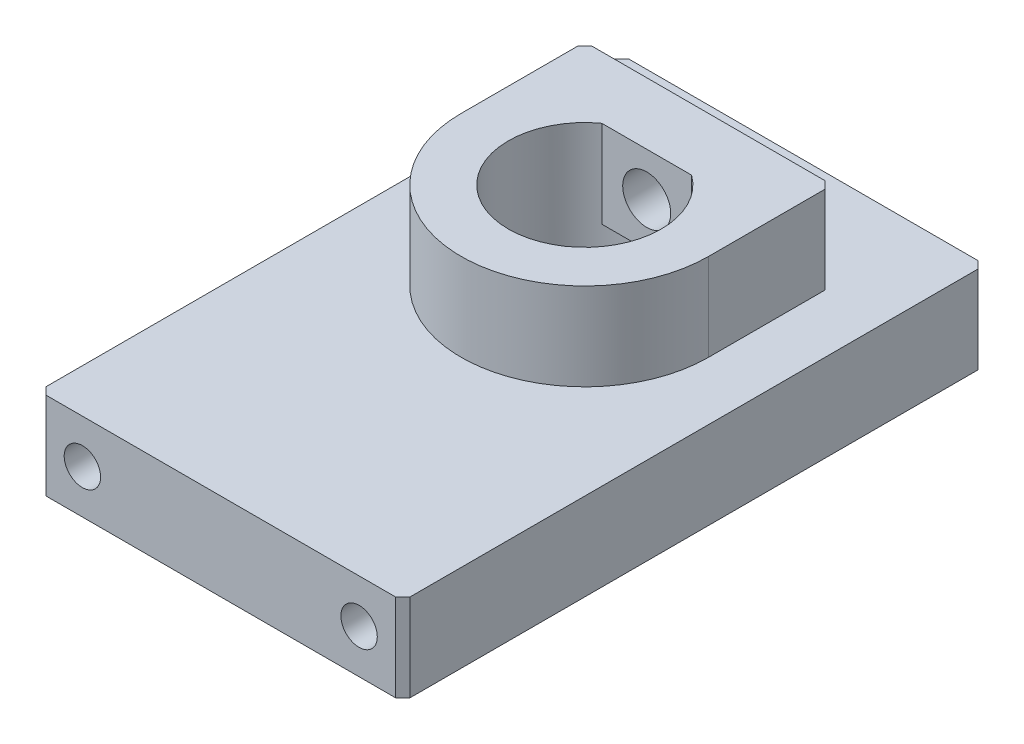
ISO-10303-21;
HEADER;
FILE_DESCRIPTION(('STEP AP214'),'2;1');
FILE_NAME('part.step','',(''),(''),'','','');
FILE_SCHEMA(('AUTOMOTIVE_DESIGN { 1 0 10303 214 1 1 1 1 }'));
ENDSEC;
DATA;
#1=APPLICATION_CONTEXT('core data for automotive mechanical design processes');
#2=APPLICATION_PROTOCOL_DEFINITION('international standard','automotive_design',2000,#1);
#3=PRODUCT_CONTEXT('',#1,'mechanical');
#4=PRODUCT('Part','Part','',(#3));
#5=PRODUCT_RELATED_PRODUCT_CATEGORY('part','',(#4));
#6=PRODUCT_DEFINITION_FORMATION('','',#4);
#7=PRODUCT_DEFINITION_CONTEXT('part definition',#1,'design');
#8=PRODUCT_DEFINITION('design','',#6,#7);
#9=PRODUCT_DEFINITION_SHAPE('','',#8);
#10=(LENGTH_UNIT() NAMED_UNIT(*) SI_UNIT(.MILLI.,.METRE.));
#11=(NAMED_UNIT(*) PLANE_ANGLE_UNIT() SI_UNIT($,.RADIAN.));
#12=(NAMED_UNIT(*) SI_UNIT($,.STERADIAN.) SOLID_ANGLE_UNIT());
#13=UNCERTAINTY_MEASURE_WITH_UNIT(LENGTH_MEASURE(1.E-05),#10,'distance_accuracy_value','');
#14=(GEOMETRIC_REPRESENTATION_CONTEXT(3) GLOBAL_UNCERTAINTY_ASSIGNED_CONTEXT((#13)) GLOBAL_UNIT_ASSIGNED_CONTEXT((#10,
#11,#12)) REPRESENTATION_CONTEXT('',''));
#15=CARTESIAN_POINT('',(0.,0.,0.));
#16=DIRECTION('',(0.,0.,1.));
#17=DIRECTION('',(1.,0.,0.));
#18=AXIS2_PLACEMENT_3D('',#15,#16,#17);
#19=CARTESIAN_POINT('',(8.5,6.,-8.));
#20=DIRECTION('',(-0.707106781186548,0.,0.707106781186548));
#21=DIRECTION('',(0.707106781186548,0.,0.707106781186548));
#22=AXIS2_PLACEMENT_3D('',#19,#20,#21);
#23=PLANE('',#22);
#24=DIRECTION('',(0.,1.,0.));
#25=VECTOR('',#24,1.);
#26=CARTESIAN_POINT('',(8.,6.,-8.5));
#27=LINE('',#26,#25);
#28=CARTESIAN_POINT('',(8.,12.,-8.5));
#29=VERTEX_POINT('',#28);
#30=CARTESIAN_POINT('',(8.,6.,-8.5));
#31=VERTEX_POINT('',#30);
#32=EDGE_CURVE('E232',#29,#31,#27,.F.);
#33=ORIENTED_EDGE('',*,*,#32,.F.);
#34=DIRECTION('',(0.707106781186548,0.,0.707106781186548));
#35=VECTOR('',#34,1.);
#36=CARTESIAN_POINT('',(8.5,12.,-8.));
#37=LINE('',#36,#35);
#38=CARTESIAN_POINT('',(8.5,12.,-8.));
#39=VERTEX_POINT('',#38);
#40=EDGE_CURVE('E224',#39,#29,#37,.F.);
#41=ORIENTED_EDGE('',*,*,#40,.F.);
#42=DIRECTION('',(0.,1.,0.));
#43=VECTOR('',#42,1.);
#44=CARTESIAN_POINT('',(8.5,6.,-8.));
#45=LINE('',#44,#43);
#46=CARTESIAN_POINT('',(8.5,6.,-8.));
#47=VERTEX_POINT('',#46);
#48=EDGE_CURVE('E198',#47,#39,#45,.T.);
#49=ORIENTED_EDGE('',*,*,#48,.F.);
#50=DIRECTION('',(0.707106781186548,0.,0.707106781186548));
#51=VECTOR('',#50,1.);
#52=CARTESIAN_POINT('',(8.5,6.,-8.));
#53=LINE('',#52,#51);
#54=EDGE_CURVE('E217',#31,#47,#53,.T.);
#55=ORIENTED_EDGE('',*,*,#54,.F.);
#56=EDGE_LOOP('',(#33,#41,#49,#55));
#57=FACE_BOUND('',#56,.T.);
#58=ADVANCED_FACE('F17',(#57),#23,.F.);
#59=CARTESIAN_POINT('',(-8.,6.,-8.5));
#60=DIRECTION('',(0.707106781186548,0.,0.707106781186548));
#61=DIRECTION('',(0.707106781186548,0.,-0.707106781186548));
#62=AXIS2_PLACEMENT_3D('',#59,#60,#61);
#63=PLANE('',#62);
#64=DIRECTION('',(0.,1.,0.));
#65=VECTOR('',#64,1.);
#66=CARTESIAN_POINT('',(-8.5,6.,-8.));
#67=LINE('',#66,#65);
#68=CARTESIAN_POINT('',(-8.5,12.,-8.));
#69=VERTEX_POINT('',#68);
#70=CARTESIAN_POINT('',(-8.5,6.,-8.));
#71=VERTEX_POINT('',#70);
#72=EDGE_CURVE('E150',#69,#71,#67,.F.);
#73=ORIENTED_EDGE('',*,*,#72,.F.);
#74=DIRECTION('',(0.707106781186548,0.,-0.707106781186548));
#75=VECTOR('',#74,1.);
#76=CARTESIAN_POINT('',(-8.,12.,-8.5));
#77=LINE('',#76,#75);
#78=CARTESIAN_POINT('',(-8.,12.,-8.5));
#79=VERTEX_POINT('',#78);
#80=EDGE_CURVE('E163',#79,#69,#77,.F.);
#81=ORIENTED_EDGE('',*,*,#80,.F.);
#82=DIRECTION('',(0.,1.,0.));
#83=VECTOR('',#82,1.);
#84=CARTESIAN_POINT('',(-8.,6.,-8.5));
#85=LINE('',#84,#83);
#86=CARTESIAN_POINT('',(-8.,6.,-8.5));
#87=VERTEX_POINT('',#86);
#88=EDGE_CURVE('E195',#87,#79,#85,.T.);
#89=ORIENTED_EDGE('',*,*,#88,.F.);
#90=DIRECTION('',(0.707106781186548,0.,-0.707106781186548));
#91=VECTOR('',#90,1.);
#92=CARTESIAN_POINT('',(-8.,6.,-8.5));
#93=LINE('',#92,#91);
#94=EDGE_CURVE('E201',#71,#87,#93,.T.);
#95=ORIENTED_EDGE('',*,*,#94,.F.);
#96=EDGE_LOOP('',(#73,#81,#89,#95));
#97=FACE_BOUND('',#96,.T.);
#98=ADVANCED_FACE('F278',(#97),#63,.F.);
#99=CARTESIAN_POINT('',(0.,9.,-8.5));
#100=DIRECTION('',(0.,0.,-1.));
#101=DIRECTION('',(-1.,0.,0.));
#102=AXIS2_PLACEMENT_3D('',#99,#100,#101);
#103=CYLINDRICAL_SURFACE('',#102,1.65);
#104=CARTESIAN_POINT('',(0.,9.,-4.25));
#105=DIRECTION('',(0.,0.,-1.));
#106=DIRECTION('',(-1.,0.,0.));
#107=AXIS2_PLACEMENT_3D('',#104,#105,#106);
#108=CIRCLE('',#107,1.65);
#109=CARTESIAN_POINT('',(-1.65,9.,-4.25));
#110=VERTEX_POINT('',#109);
#111=EDGE_CURVE('E188',#110,#110,#108,.T.);
#112=ORIENTED_EDGE('',*,*,#111,.F.);
#113=EDGE_LOOP('',(#112));
#114=FACE_BOUND('',#113,.T.);
#115=CARTESIAN_POINT('',(0.,9.,-8.5));
#116=DIRECTION('',(0.,0.,-1.));
#117=DIRECTION('',(-1.,0.,0.));
#118=AXIS2_PLACEMENT_3D('',#115,#116,#117);
#119=CIRCLE('',#118,1.65);
#120=CARTESIAN_POINT('',(-1.65,9.,-8.5));
#121=VERTEX_POINT('',#120);
#122=EDGE_CURVE('E20',#121,#121,#119,.F.);
#123=ORIENTED_EDGE('',*,*,#122,.F.);
#124=EDGE_LOOP('',(#123));
#125=FACE_BOUND('',#124,.T.);
#126=ADVANCED_FACE('F274',(#114,#125),#103,.F.);
#127=CARTESIAN_POINT('',(-9.5,3.,16.4999999999509));
#128=DIRECTION('',(0.,0.,1.));
#129=DIRECTION('',(1.,0.,0.));
#130=AXIS2_PLACEMENT_3D('',#127,#128,#129);
#131=CONICAL_SURFACE('',#130,1.25000000002456,1.02974425868001);
#132=CARTESIAN_POINT('',(-9.49999999994589,3.,15.7489242261306));
#133=VERTEX_POINT('',#132);
#134=VERTEX_LOOP('',#133);
#135=FACE_BOUND('',#134,.T.);
#136=CARTESIAN_POINT('',(-9.5,3.,16.5));
#137=DIRECTION('',(0.,0.,1.));
#138=DIRECTION('',(1.,0.,0.));
#139=AXIS2_PLACEMENT_3D('',#136,#137,#138);
#140=CIRCLE('',#139,1.24999999999999);
#141=CARTESIAN_POINT('',(-8.25000000000001,3.,16.5));
#142=VERTEX_POINT('',#141);
#143=EDGE_CURVE('E158',#142,#142,#140,.T.);
#144=ORIENTED_EDGE('',*,*,#143,.T.);
#145=EDGE_LOOP('',(#144));
#146=FACE_BOUND('',#145,.T.);
#147=ADVANCED_FACE('F277',(#135,#146),#131,.F.);
#148=CARTESIAN_POINT('',(9.5,3.,16.5000000000646));
#149=DIRECTION('',(0.,0.,1.));
#150=DIRECTION('',(1.,0.,0.));
#151=AXIS2_PLACEMENT_3D('',#148,#149,#150);
#152=CONICAL_SURFACE('',#151,1.25000000003002,1.02974425863038);
#153=CARTESIAN_POINT('',(9.50000000000273,3.,15.7489242262159));
#154=VERTEX_POINT('',#153);
#155=VERTEX_LOOP('',#154);
#156=FACE_BOUND('',#155,.T.);
#157=CARTESIAN_POINT('',(9.5,3.,16.5));
#158=DIRECTION('',(0.,0.,1.));
#159=DIRECTION('',(1.,0.,0.));
#160=AXIS2_PLACEMENT_3D('',#157,#158,#159);
#161=CIRCLE('',#160,1.24999999999999);
#162=CARTESIAN_POINT('',(10.75,3.,16.5));
#163=VERTEX_POINT('',#162);
#164=EDGE_CURVE('E211',#163,#163,#161,.T.);
#165=ORIENTED_EDGE('',*,*,#164,.T.);
#166=EDGE_LOOP('',(#165));
#167=FACE_BOUND('',#166,.T.);
#168=ADVANCED_FACE('F529',(#156,#167),#152,.F.);
#169=CARTESIAN_POINT('',(-9.5,3.,-6.50000000001683));
#170=DIRECTION('',(0.,0.,-1.));
#171=DIRECTION('',(0.,1.,0.));
#172=AXIS2_PLACEMENT_3D('',#169,#170,#171);
#173=CONICAL_SURFACE('',#172,1.25000000003001,1.02974425868194);
#174=CARTESIAN_POINT('',(-9.50000000000273,3.,-5.74892422622497));
#175=VERTEX_POINT('',#174);
#176=VERTEX_LOOP('',#175);
#177=FACE_BOUND('',#176,.T.);
#178=CARTESIAN_POINT('',(-9.5,3.,-6.49999999999999));
#179=DIRECTION('',(0.,0.,-1.));
#180=DIRECTION('',(-1.,0.,0.));
#181=AXIS2_PLACEMENT_3D('',#178,#179,#180);
#182=CIRCLE('',#181,1.24999999999999);
#183=CARTESIAN_POINT('',(-10.75,3.,-6.49999999999999));
#184=VERTEX_POINT('',#183);
#185=EDGE_CURVE('E208',#184,#184,#182,.T.);
#186=ORIENTED_EDGE('',*,*,#185,.T.);
#187=EDGE_LOOP('',(#186));
#188=FACE_BOUND('',#187,.T.);
#189=ADVANCED_FACE('F520',(#177,#188),#173,.F.);
#190=CARTESIAN_POINT('',(9.5,3.,-6.49999999995998));
#191=DIRECTION('',(0.,0.,-1.));
#192=DIRECTION('',(-1.,0.,0.));
#193=AXIS2_PLACEMENT_3D('',#190,#191,#192);
#194=CONICAL_SURFACE('',#193,1.25000000002455,1.02974425868001);
#195=CARTESIAN_POINT('',(9.50000000000273,3.,-5.74892422616813));
#196=VERTEX_POINT('',#195);
#197=VERTEX_LOOP('',#196);
#198=FACE_BOUND('',#197,.T.);
#199=CARTESIAN_POINT('',(9.5,3.,-6.49999999999999));
#200=DIRECTION('',(0.,0.,-1.));
#201=DIRECTION('',(-1.,0.,0.));
#202=AXIS2_PLACEMENT_3D('',#199,#200,#201);
#203=CIRCLE('',#202,1.24999999999999);
#204=CARTESIAN_POINT('',(8.25000000000001,3.,-6.49999999999999));
#205=VERTEX_POINT('',#204);
#206=EDGE_CURVE('E204',#205,#205,#203,.T.);
#207=ORIENTED_EDGE('',*,*,#206,.T.);
#208=EDGE_LOOP('',(#207));
#209=FACE_BOUND('',#208,.T.);
#210=ADVANCED_FACE('F294',(#198,#209),#194,.F.);
#211=CARTESIAN_POINT('',(8.5,6.,0.));
#212=DIRECTION('',(1.,0.,0.));
#213=DIRECTION('',(0.,0.,-1.));
#214=AXIS2_PLACEMENT_3D('',#211,#212,#213);
#215=PLANE('',#214);
#216=DIRECTION('',(0.,0.,1.));
#217=VECTOR('',#216,1.);
#218=CARTESIAN_POINT('',(8.5,12.,0.));
#219=LINE('',#218,#217);
#220=CARTESIAN_POINT('',(8.5,12.,0.));
#221=VERTEX_POINT('',#220);
#222=EDGE_CURVE('E167',#221,#39,#219,.F.);
#223=ORIENTED_EDGE('',*,*,#222,.F.);
#224=DIRECTION('',(0.,-1.,0.));
#225=VECTOR('',#224,1.);
#226=CARTESIAN_POINT('',(8.5,12.,0.));
#227=LINE('',#226,#225);
#228=CARTESIAN_POINT('',(8.5,6.,0.));
#229=VERTEX_POINT('',#228);
#230=EDGE_CURVE('E149',#229,#221,#227,.F.);
#231=ORIENTED_EDGE('',*,*,#230,.F.);
#232=DIRECTION('',(0.,0.,-1.));
#233=VECTOR('',#232,1.);
#234=CARTESIAN_POINT('',(8.5,6.,0.));
#235=LINE('',#234,#233);
#236=EDGE_CURVE('E238',#229,#47,#235,.T.);
#237=ORIENTED_EDGE('',*,*,#236,.T.);
#238=ORIENTED_EDGE('',*,*,#48,.T.);
#239=EDGE_LOOP('',(#223,#231,#237,#238));
#240=FACE_BOUND('',#239,.T.);
#241=ADVANCED_FACE('F285',(#240),#215,.T.);
#242=CARTESIAN_POINT('',(-8.5,6.,-8.5));
#243=DIRECTION('',(0.,0.,-1.));
#244=DIRECTION('',(-1.,0.,0.));
#245=AXIS2_PLACEMENT_3D('',#242,#243,#244);
#246=PLANE('',#245);
#247=DIRECTION('',(1.,0.,0.));
#248=VECTOR('',#247,1.);
#249=CARTESIAN_POINT('',(0.,6.,-8.5));
#250=LINE('',#249,#248);
#251=EDGE_CURVE('E235',#31,#87,#250,.F.);
#252=ORIENTED_EDGE('',*,*,#251,.T.);
#253=ORIENTED_EDGE('',*,*,#88,.T.);
#254=DIRECTION('',(1.,0.,0.));
#255=VECTOR('',#254,1.);
#256=CARTESIAN_POINT('',(0.,12.,-8.5));
#257=LINE('',#256,#255);
#258=EDGE_CURVE('E165',#29,#79,#257,.F.);
#259=ORIENTED_EDGE('',*,*,#258,.F.);
#260=ORIENTED_EDGE('',*,*,#32,.T.);
#261=EDGE_LOOP('',(#252,#253,#259,#260));
#262=FACE_BOUND('',#261,.T.);
#263=ORIENTED_EDGE('',*,*,#122,.T.);
#264=EDGE_LOOP('',(#263));
#265=FACE_BOUND('',#264,.T.);
#266=ADVANCED_FACE('F283',(#262,#265),#246,.T.);
#267=CARTESIAN_POINT('',(-8.5,6.,0.));
#268=DIRECTION('',(-1.,0.,0.));
#269=DIRECTION('',(0.,0.,1.));
#270=AXIS2_PLACEMENT_3D('',#267,#268,#269);
#271=PLANE('',#270);
#272=DIRECTION('',(0.,0.,-1.));
#273=VECTOR('',#272,1.);
#274=CARTESIAN_POINT('',(-8.5,6.,0.));
#275=LINE('',#274,#273);
#276=CARTESIAN_POINT('',(-8.5,6.,0.));
#277=VERTEX_POINT('',#276);
#278=EDGE_CURVE('E145',#71,#277,#275,.F.);
#279=ORIENTED_EDGE('',*,*,#278,.T.);
#280=DIRECTION('',(0.,-1.,0.));
#281=VECTOR('',#280,1.);
#282=CARTESIAN_POINT('',(-8.5,12.,0.));
#283=LINE('',#282,#281);
#284=CARTESIAN_POINT('',(-8.5,12.,0.));
#285=VERTEX_POINT('',#284);
#286=EDGE_CURVE('E138',#285,#277,#283,.T.);
#287=ORIENTED_EDGE('',*,*,#286,.F.);
#288=DIRECTION('',(0.,0.,1.));
#289=VECTOR('',#288,1.);
#290=CARTESIAN_POINT('',(-8.5,12.,0.));
#291=LINE('',#290,#289);
#292=EDGE_CURVE('E143',#69,#285,#291,.T.);
#293=ORIENTED_EDGE('',*,*,#292,.F.);
#294=ORIENTED_EDGE('',*,*,#72,.T.);
#295=EDGE_LOOP('',(#279,#287,#293,#294));
#296=FACE_BOUND('',#295,.T.);
#297=ADVANCED_FACE('F140',(#296),#271,.T.);
#298=CARTESIAN_POINT('',(0.,12.,0.));
#299=DIRECTION('',(0.,-1.,0.));
#300=DIRECTION('',(0.,0.,-1.));
#301=AXIS2_PLACEMENT_3D('',#298,#299,#300);
#302=CYLINDRICAL_SURFACE('',#301,8.5);
#303=CARTESIAN_POINT('',(0.,6.,0.));
#304=DIRECTION('',(0.,-1.,0.));
#305=DIRECTION('',(0.,0.,-1.));
#306=AXIS2_PLACEMENT_3D('',#303,#304,#305);
#307=CIRCLE('',#306,8.5);
#308=EDGE_CURVE('E191',#277,#229,#307,.F.);
#309=ORIENTED_EDGE('',*,*,#308,.T.);
#310=ORIENTED_EDGE('',*,*,#230,.T.);
#311=CARTESIAN_POINT('',(0.,12.,0.));
#312=DIRECTION('',(0.,-1.,0.));
#313=DIRECTION('',(0.,0.,-1.));
#314=AXIS2_PLACEMENT_3D('',#311,#312,#313);
#315=CIRCLE('',#314,8.5);
#316=EDGE_CURVE('E154',#285,#221,#315,.F.);
#317=ORIENTED_EDGE('',*,*,#316,.F.);
#318=ORIENTED_EDGE('',*,*,#286,.T.);
#319=EDGE_LOOP('',(#309,#310,#317,#318));
#320=FACE_BOUND('',#319,.T.);
#321=ADVANCED_FACE('F155',(#320),#302,.T.);
#322=CARTESIAN_POINT('',(0.,6.,0.));
#323=DIRECTION('',(0.,1.,0.));
#324=DIRECTION('',(0.,0.,1.));
#325=AXIS2_PLACEMENT_3D('',#322,#323,#324);
#326=PLANE('',#325);
#327=DIRECTION('',(1.,0.,0.));
#328=VECTOR('',#327,1.);
#329=CARTESIAN_POINT('',(-3.08220700148449,6.,-4.25));
#330=LINE('',#329,#328);
#331=CARTESIAN_POINT('',(-3.08220700148449,6.,-4.25));
#332=VERTEX_POINT('',#331);
#333=CARTESIAN_POINT('',(3.08220700148449,6.,-4.25));
#334=VERTEX_POINT('',#333);
#335=EDGE_CURVE('E181',#332,#334,#330,.T.);
#336=ORIENTED_EDGE('',*,*,#335,.F.);
#337=CARTESIAN_POINT('',(0.,6.,0.));
#338=DIRECTION('',(0.,-1.,0.));
#339=DIRECTION('',(0.,0.,-1.));
#340=AXIS2_PLACEMENT_3D('',#337,#338,#339);
#341=CIRCLE('',#340,5.25);
#342=EDGE_CURVE('E185',#332,#334,#341,.T.);
#343=ORIENTED_EDGE('',*,*,#342,.T.);
#344=EDGE_LOOP('',(#336,#343));
#345=FACE_BOUND('',#344,.T.);
#346=ADVANCED_FACE('F364',(#345),#326,.F.);
#347=CARTESIAN_POINT('',(-3.08220700148449,6.,-4.25));
#348=DIRECTION('',(0.,0.,1.));
#349=DIRECTION('',(1.,0.,0.));
#350=AXIS2_PLACEMENT_3D('',#347,#348,#349);
#351=PLANE('',#350);
#352=ORIENTED_EDGE('',*,*,#335,.T.);
#353=DIRECTION('',(0.,-1.,0.));
#354=VECTOR('',#353,1.);
#355=CARTESIAN_POINT('',(3.08220700148449,12.,-4.25));
#356=LINE('',#355,#354);
#357=CARTESIAN_POINT('',(3.08220700148449,12.,-4.25));
#358=VERTEX_POINT('',#357);
#359=EDGE_CURVE('E182',#334,#358,#356,.F.);
#360=ORIENTED_EDGE('',*,*,#359,.T.);
#361=DIRECTION('',(1.,0.,0.));
#362=VECTOR('',#361,1.);
#363=CARTESIAN_POINT('',(0.,12.,-4.25));
#364=LINE('',#363,#362);
#365=CARTESIAN_POINT('',(-3.08220700148449,12.,-4.25));
#366=VERTEX_POINT('',#365);
#367=EDGE_CURVE('E176',#366,#358,#364,.T.);
#368=ORIENTED_EDGE('',*,*,#367,.F.);
#369=DIRECTION('',(0.,-1.,0.));
#370=VECTOR('',#369,1.);
#371=CARTESIAN_POINT('',(-3.08220700148449,12.,-4.25));
#372=LINE('',#371,#370);
#373=EDGE_CURVE('E189',#366,#332,#372,.T.);
#374=ORIENTED_EDGE('',*,*,#373,.T.);
#375=EDGE_LOOP('',(#352,#360,#368,#374));
#376=FACE_BOUND('',#375,.T.);
#377=ORIENTED_EDGE('',*,*,#111,.T.);
#378=EDGE_LOOP('',(#377));
#379=FACE_BOUND('',#378,.T.);
#380=ADVANCED_FACE('F272',(#376,#379),#351,.T.);
#381=CARTESIAN_POINT('',(0.,12.,0.));
#382=DIRECTION('',(0.,1.,0.));
#383=DIRECTION('',(0.,0.,1.));
#384=AXIS2_PLACEMENT_3D('',#381,#382,#383);
#385=PLANE('',#384);
#386=ORIENTED_EDGE('',*,*,#292,.T.);
#387=ORIENTED_EDGE('',*,*,#316,.T.);
#388=ORIENTED_EDGE('',*,*,#222,.T.);
#389=ORIENTED_EDGE('',*,*,#40,.T.);
#390=ORIENTED_EDGE('',*,*,#258,.T.);
#391=ORIENTED_EDGE('',*,*,#80,.T.);
#392=EDGE_LOOP('',(#386,#387,#388,#389,#390,#391));
#393=FACE_BOUND('',#392,.T.);
#394=ORIENTED_EDGE('',*,*,#367,.T.);
#395=CARTESIAN_POINT('',(0.,12.,0.));
#396=DIRECTION('',(0.,-1.,0.));
#397=DIRECTION('',(0.,0.,-1.));
#398=AXIS2_PLACEMENT_3D('',#395,#396,#397);
#399=CIRCLE('',#398,5.25);
#400=EDGE_CURVE('E184',#358,#366,#399,.T.);
#401=ORIENTED_EDGE('',*,*,#400,.T.);
#402=EDGE_LOOP('',(#394,#401));
#403=FACE_BOUND('',#402,.T.);
#404=ADVANCED_FACE('F160',(#393,#403),#385,.T.);
#405=CARTESIAN_POINT('',(-9.5,3.,25.));
#406=DIRECTION('',(0.,0.,1.));
#407=DIRECTION('',(1.,0.,0.));
#408=AXIS2_PLACEMENT_3D('',#405,#406,#407);
#409=CYLINDRICAL_SURFACE('',#408,1.24999999999999);
#410=ORIENTED_EDGE('',*,*,#143,.F.);
#411=EDGE_LOOP('',(#410));
#412=FACE_BOUND('',#411,.T.);
#413=CARTESIAN_POINT('',(-9.5,3.,25.));
#414=DIRECTION('',(0.,0.,1.));
#415=DIRECTION('',(1.,0.,0.));
#416=AXIS2_PLACEMENT_3D('',#413,#414,#415);
#417=CIRCLE('',#416,1.24999999999999);
#418=CARTESIAN_POINT('',(-8.25000000000001,3.,25.));
#419=VERTEX_POINT('',#418);
#420=EDGE_CURVE('E264',#419,#419,#417,.T.);
#421=ORIENTED_EDGE('',*,*,#420,.T.);
#422=EDGE_LOOP('',(#421));
#423=FACE_BOUND('',#422,.T.);
#424=ADVANCED_FACE('F355',(#412,#423),#409,.F.);
#425=CARTESIAN_POINT('',(9.5,3.,25.));
#426=DIRECTION('',(0.,0.,1.));
#427=DIRECTION('',(1.,0.,0.));
#428=AXIS2_PLACEMENT_3D('',#425,#426,#427);
#429=CYLINDRICAL_SURFACE('',#428,1.24999999999999);
#430=ORIENTED_EDGE('',*,*,#164,.F.);
#431=EDGE_LOOP('',(#430));
#432=FACE_BOUND('',#431,.T.);
#433=CARTESIAN_POINT('',(9.5,3.,25.));
#434=DIRECTION('',(0.,0.,1.));
#435=DIRECTION('',(1.,0.,0.));
#436=AXIS2_PLACEMENT_3D('',#433,#434,#435);
#437=CIRCLE('',#436,1.24999999999999);
#438=CARTESIAN_POINT('',(10.75,3.,25.));
#439=VERTEX_POINT('',#438);
#440=EDGE_CURVE('E260',#439,#439,#437,.T.);
#441=ORIENTED_EDGE('',*,*,#440,.T.);
#442=EDGE_LOOP('',(#441));
#443=FACE_BOUND('',#442,.T.);
#444=ADVANCED_FACE('F351',(#432,#443),#429,.F.);
#445=CARTESIAN_POINT('',(-12.,6.,25.));
#446=DIRECTION('',(0.707106781186548,0.,-0.707106781186548));
#447=DIRECTION('',(-0.707106781186548,0.,-0.707106781186548));
#448=AXIS2_PLACEMENT_3D('',#445,#446,#447);
#449=PLANE('',#448);
#450=DIRECTION('',(0.,1.,0.));
#451=VECTOR('',#450,1.);
#452=CARTESIAN_POINT('',(-12.5,6.,24.5));
#453=LINE('',#452,#451);
#454=CARTESIAN_POINT('',(-12.5,6.,24.5));
#455=VERTEX_POINT('',#454);
#456=CARTESIAN_POINT('',(-12.5,0.,24.5));
#457=VERTEX_POINT('',#456);
#458=EDGE_CURVE('E259',#455,#457,#453,.F.);
#459=ORIENTED_EDGE('',*,*,#458,.T.);
#460=DIRECTION('',(-0.707106781186548,0.,-0.707106781186548));
#461=VECTOR('',#460,1.);
#462=CARTESIAN_POINT('',(-12.,0.,25.));
#463=LINE('',#462,#461);
#464=CARTESIAN_POINT('',(-12.,0.,25.));
#465=VERTEX_POINT('',#464);
#466=EDGE_CURVE('E171',#465,#457,#463,.T.);
#467=ORIENTED_EDGE('',*,*,#466,.F.);
#468=DIRECTION('',(0.,1.,0.));
#469=VECTOR('',#468,1.);
#470=CARTESIAN_POINT('',(-12.,6.,25.));
#471=LINE('',#470,#469);
#472=CARTESIAN_POINT('',(-12.,6.,25.));
#473=VERTEX_POINT('',#472);
#474=EDGE_CURVE('E641',#465,#473,#471,.T.);
#475=ORIENTED_EDGE('',*,*,#474,.T.);
#476=DIRECTION('',(-0.707106781186547,0.,-0.707106781186547));
#477=VECTOR('',#476,1.);
#478=CARTESIAN_POINT('',(-12.,6.,25.));
#479=LINE('',#478,#477);
#480=EDGE_CURVE('E584',#473,#455,#479,.T.);
#481=ORIENTED_EDGE('',*,*,#480,.T.);
#482=EDGE_LOOP('',(#459,#467,#475,#481));
#483=FACE_BOUND('',#482,.T.);
#484=ADVANCED_FACE('F347',(#483),#449,.F.);
#485=CARTESIAN_POINT('',(-9.5,3.,-15.));
#486=DIRECTION('',(0.,0.,-1.));
#487=DIRECTION('',(-1.,0.,0.));
#488=AXIS2_PLACEMENT_3D('',#485,#486,#487);
#489=CYLINDRICAL_SURFACE('',#488,1.24999999999999);
#490=ORIENTED_EDGE('',*,*,#185,.F.);
#491=EDGE_LOOP('',(#490));
#492=FACE_BOUND('',#491,.T.);
#493=CARTESIAN_POINT('',(-9.5,3.,-15.));
#494=DIRECTION('',(0.,0.,-1.));
#495=DIRECTION('',(-1.,0.,0.));
#496=AXIS2_PLACEMENT_3D('',#493,#494,#495);
#497=CIRCLE('',#496,1.24999999999999);
#498=CARTESIAN_POINT('',(-10.75,3.,-15.));
#499=VERTEX_POINT('',#498);
#500=EDGE_CURVE('E256',#499,#499,#497,.T.);
#501=ORIENTED_EDGE('',*,*,#500,.T.);
#502=EDGE_LOOP('',(#501));
#503=FACE_BOUND('',#502,.T.);
#504=ADVANCED_FACE('F343',(#492,#503),#489,.F.);
#505=CARTESIAN_POINT('',(9.5,3.,-15.));
#506=DIRECTION('',(0.,0.,-1.));
#507=DIRECTION('',(-1.,0.,0.));
#508=AXIS2_PLACEMENT_3D('',#505,#506,#507);
#509=CYLINDRICAL_SURFACE('',#508,1.24999999999999);
#510=ORIENTED_EDGE('',*,*,#206,.F.);
#511=EDGE_LOOP('',(#510));
#512=FACE_BOUND('',#511,.T.);
#513=CARTESIAN_POINT('',(9.5,3.,-15.));
#514=DIRECTION('',(0.,0.,-1.));
#515=DIRECTION('',(-1.,0.,0.));
#516=AXIS2_PLACEMENT_3D('',#513,#514,#515);
#517=CIRCLE('',#516,1.24999999999999);
#518=CARTESIAN_POINT('',(8.25000000000001,3.,-15.));
#519=VERTEX_POINT('',#518);
#520=EDGE_CURVE('E252',#519,#519,#517,.T.);
#521=ORIENTED_EDGE('',*,*,#520,.T.);
#522=EDGE_LOOP('',(#521));
#523=FACE_BOUND('',#522,.T.);
#524=ADVANCED_FACE('F339',(#512,#523),#509,.F.);
#525=CARTESIAN_POINT('',(-12.5,6.,-14.5));
#526=DIRECTION('',(0.707106781186548,0.,0.707106781186548));
#527=DIRECTION('',(0.707106781186548,0.,-0.707106781186548));
#528=AXIS2_PLACEMENT_3D('',#525,#526,#527);
#529=PLANE('',#528);
#530=DIRECTION('',(0.,1.,0.));
#531=VECTOR('',#530,1.);
#532=CARTESIAN_POINT('',(-12.,6.,-15.));
#533=LINE('',#532,#531);
#534=CARTESIAN_POINT('',(-12.,6.,-15.));
#535=VERTEX_POINT('',#534);
#536=CARTESIAN_POINT('',(-12.,0.,-15.));
#537=VERTEX_POINT('',#536);
#538=EDGE_CURVE('E255',#535,#537,#533,.F.);
#539=ORIENTED_EDGE('',*,*,#538,.T.);
#540=DIRECTION('',(0.707106781186548,0.,-0.707106781186548));
#541=VECTOR('',#540,1.);
#542=CARTESIAN_POINT('',(-12.5,0.,-14.5));
#543=LINE('',#542,#541);
#544=CARTESIAN_POINT('',(-12.5,0.,-14.5));
#545=VERTEX_POINT('',#544);
#546=EDGE_CURVE('E207',#545,#537,#543,.T.);
#547=ORIENTED_EDGE('',*,*,#546,.F.);
#548=DIRECTION('',(0.,1.,0.));
#549=VECTOR('',#548,1.);
#550=CARTESIAN_POINT('',(-12.5,6.,-14.5));
#551=LINE('',#550,#549);
#552=CARTESIAN_POINT('',(-12.5,6.,-14.5));
#553=VERTEX_POINT('',#552);
#554=EDGE_CURVE('E636',#545,#553,#551,.T.);
#555=ORIENTED_EDGE('',*,*,#554,.T.);
#556=DIRECTION('',(0.707106781186547,0.,-0.707106781186547));
#557=VECTOR('',#556,1.);
#558=CARTESIAN_POINT('',(-12.5,6.,-14.5));
#559=LINE('',#558,#557);
#560=EDGE_CURVE('E597',#553,#535,#559,.T.);
#561=ORIENTED_EDGE('',*,*,#560,.T.);
#562=EDGE_LOOP('',(#539,#547,#555,#561));
#563=FACE_BOUND('',#562,.T.);
#564=ADVANCED_FACE('F335',(#563),#529,.F.);
#565=CARTESIAN_POINT('',(12.,6.,-15.));
#566=DIRECTION('',(-0.707106781186548,0.,0.707106781186548));
#567=DIRECTION('',(0.707106781186548,0.,0.707106781186548));
#568=AXIS2_PLACEMENT_3D('',#565,#566,#567);
#569=PLANE('',#568);
#570=DIRECTION('',(0.,1.,0.));
#571=VECTOR('',#570,1.);
#572=CARTESIAN_POINT('',(12.5,6.,-14.5));
#573=LINE('',#572,#571);
#574=CARTESIAN_POINT('',(12.5,6.,-14.5));
#575=VERTEX_POINT('',#574);
#576=CARTESIAN_POINT('',(12.5,0.,-14.5));
#577=VERTEX_POINT('',#576);
#578=EDGE_CURVE('E625',#575,#577,#573,.F.);
#579=ORIENTED_EDGE('',*,*,#578,.T.);
#580=DIRECTION('',(0.707106781186548,0.,0.707106781186548));
#581=VECTOR('',#580,1.);
#582=CARTESIAN_POINT('',(12.,0.,-15.));
#583=LINE('',#582,#581);
#584=CARTESIAN_POINT('',(12.,0.,-15.));
#585=VERTEX_POINT('',#584);
#586=EDGE_CURVE('E600',#585,#577,#583,.T.);
#587=ORIENTED_EDGE('',*,*,#586,.F.);
#588=DIRECTION('',(0.,1.,0.));
#589=VECTOR('',#588,1.);
#590=CARTESIAN_POINT('',(12.,6.,-15.));
#591=LINE('',#590,#589);
#592=CARTESIAN_POINT('',(12.,6.,-15.));
#593=VERTEX_POINT('',#592);
#594=EDGE_CURVE('E612',#585,#593,#591,.T.);
#595=ORIENTED_EDGE('',*,*,#594,.T.);
#596=DIRECTION('',(0.707106781186547,0.,0.707106781186547));
#597=VECTOR('',#596,1.);
#598=CARTESIAN_POINT('',(12.,6.,-15.));
#599=LINE('',#598,#597);
#600=EDGE_CURVE('E595',#593,#575,#599,.T.);
#601=ORIENTED_EDGE('',*,*,#600,.T.);
#602=EDGE_LOOP('',(#579,#587,#595,#601));
#603=FACE_BOUND('',#602,.T.);
#604=ADVANCED_FACE('F332',(#603),#569,.F.);
#605=CARTESIAN_POINT('',(12.5,6.,24.5));
#606=DIRECTION('',(-0.707106781186548,0.,-0.707106781186548));
#607=DIRECTION('',(-0.707106781186548,0.,0.707106781186548));
#608=AXIS2_PLACEMENT_3D('',#605,#606,#607);
#609=PLANE('',#608);
#610=DIRECTION('',(0.,1.,0.));
#611=VECTOR('',#610,1.);
#612=CARTESIAN_POINT('',(12.,6.,25.));
#613=LINE('',#612,#611);
#614=CARTESIAN_POINT('',(12.,6.,25.));
#615=VERTEX_POINT('',#614);
#616=CARTESIAN_POINT('',(12.,0.,25.));
#617=VERTEX_POINT('',#616);
#618=EDGE_CURVE('E263',#615,#617,#613,.F.);
#619=ORIENTED_EDGE('',*,*,#618,.T.);
#620=DIRECTION('',(-0.707106781186548,0.,0.707106781186548));
#621=VECTOR('',#620,1.);
#622=CARTESIAN_POINT('',(12.5,0.,24.5));
#623=LINE('',#622,#621);
#624=CARTESIAN_POINT('',(12.5,0.,24.5));
#625=VERTEX_POINT('',#624);
#626=EDGE_CURVE('E35',#625,#617,#623,.T.);
#627=ORIENTED_EDGE('',*,*,#626,.F.);
#628=DIRECTION('',(0.,1.,0.));
#629=VECTOR('',#628,1.);
#630=CARTESIAN_POINT('',(12.5,6.,24.5));
#631=LINE('',#630,#629);
#632=CARTESIAN_POINT('',(12.5,6.,24.5));
#633=VERTEX_POINT('',#632);
#634=EDGE_CURVE('E623',#625,#633,#631,.T.);
#635=ORIENTED_EDGE('',*,*,#634,.T.);
#636=DIRECTION('',(-0.707106781186552,0.,0.707106781186542));
#637=VECTOR('',#636,1.);
#638=CARTESIAN_POINT('',(12.5,6.,24.5));
#639=LINE('',#638,#637);
#640=EDGE_CURVE('E586',#633,#615,#639,.T.);
#641=ORIENTED_EDGE('',*,*,#640,.T.);
#642=EDGE_LOOP('',(#619,#627,#635,#641));
#643=FACE_BOUND('',#642,.T.);
#644=ADVANCED_FACE('F328',(#643),#609,.F.);
#645=CARTESIAN_POINT('',(0.,6.,0.));
#646=DIRECTION('',(0.,-1.,0.));
#647=DIRECTION('',(0.,0.,-1.));
#648=AXIS2_PLACEMENT_3D('',#645,#646,#647);
#649=PLANE('',#648);
#650=ORIENTED_EDGE('',*,*,#278,.F.);
#651=ORIENTED_EDGE('',*,*,#94,.T.);
#652=ORIENTED_EDGE('',*,*,#251,.F.);
#653=ORIENTED_EDGE('',*,*,#54,.T.);
#654=ORIENTED_EDGE('',*,*,#236,.F.);
#655=ORIENTED_EDGE('',*,*,#308,.F.);
#656=EDGE_LOOP('',(#650,#651,#652,#653,#654,#655));
#657=FACE_BOUND('',#656,.T.);
#658=ORIENTED_EDGE('',*,*,#480,.F.);
#659=DIRECTION('',(-1.,0.,0.));
#660=VECTOR('',#659,1.);
#661=CARTESIAN_POINT('',(-12.5,6.,25.));
#662=LINE('',#661,#660);
#663=EDGE_CURVE('E638',#473,#615,#662,.F.);
#664=ORIENTED_EDGE('',*,*,#663,.T.);
#665=ORIENTED_EDGE('',*,*,#640,.F.);
#666=DIRECTION('',(0.,0.,1.));
#667=VECTOR('',#666,1.);
#668=CARTESIAN_POINT('',(12.5,6.,25.));
#669=LINE('',#668,#667);
#670=EDGE_CURVE('E251',#633,#575,#669,.F.);
#671=ORIENTED_EDGE('',*,*,#670,.T.);
#672=ORIENTED_EDGE('',*,*,#600,.F.);
#673=DIRECTION('',(1.,0.,0.));
#674=VECTOR('',#673,1.);
#675=CARTESIAN_POINT('',(-12.5,6.,-15.));
#676=LINE('',#675,#674);
#677=EDGE_CURVE('E628',#593,#535,#676,.F.);
#678=ORIENTED_EDGE('',*,*,#677,.T.);
#679=ORIENTED_EDGE('',*,*,#560,.F.);
#680=DIRECTION('',(0.,0.,-1.));
#681=VECTOR('',#680,1.);
#682=CARTESIAN_POINT('',(-12.5,6.,25.));
#683=LINE('',#682,#681);
#684=EDGE_CURVE('E633',#553,#455,#683,.F.);
#685=ORIENTED_EDGE('',*,*,#684,.T.);
#686=EDGE_LOOP('',(#658,#664,#665,#671,#672,#678,#679,#685));
#687=FACE_BOUND('',#686,.T.);
#688=ADVANCED_FACE('F324',(#657,#687),#649,.F.);
#689=CARTESIAN_POINT('',(0.,12.,0.));
#690=DIRECTION('',(0.,-1.,0.));
#691=DIRECTION('',(0.,0.,-1.));
#692=AXIS2_PLACEMENT_3D('',#689,#690,#691);
#693=CYLINDRICAL_SURFACE('',#692,5.25);
#694=ORIENTED_EDGE('',*,*,#342,.F.);
#695=ORIENTED_EDGE('',*,*,#373,.F.);
#696=ORIENTED_EDGE('',*,*,#400,.F.);
#697=ORIENTED_EDGE('',*,*,#359,.F.);
#698=EDGE_LOOP('',(#694,#695,#696,#697));
#699=FACE_BOUND('',#698,.T.);
#700=CARTESIAN_POINT('',(0.,0.,0.));
#701=DIRECTION('',(0.,-1.,0.));
#702=DIRECTION('',(0.,0.,-1.));
#703=AXIS2_PLACEMENT_3D('',#700,#701,#702);
#704=CIRCLE('',#703,5.25);
#705=CARTESIAN_POINT('',(0.,0.,-5.25));
#706=VERTEX_POINT('',#705);
#707=EDGE_CURVE('E247',#706,#706,#704,.F.);
#708=ORIENTED_EDGE('',*,*,#707,.F.);
#709=EDGE_LOOP('',(#708));
#710=FACE_BOUND('',#709,.T.);
#711=ADVANCED_FACE('F320',(#699,#710),#693,.F.);
#712=CARTESIAN_POINT('',(-12.5,6.,25.));
#713=DIRECTION('',(0.,0.,-1.));
#714=DIRECTION('',(-1.,0.,0.));
#715=AXIS2_PLACEMENT_3D('',#712,#713,#714);
#716=PLANE('',#715);
#717=ORIENTED_EDGE('',*,*,#474,.F.);
#718=DIRECTION('',(1.,0.,0.));
#719=VECTOR('',#718,1.);
#720=CARTESIAN_POINT('',(0.,0.,25.));
#721=LINE('',#720,#719);
#722=EDGE_CURVE('E250',#617,#465,#721,.F.);
#723=ORIENTED_EDGE('',*,*,#722,.F.);
#724=ORIENTED_EDGE('',*,*,#618,.F.);
#725=ORIENTED_EDGE('',*,*,#663,.F.);
#726=EDGE_LOOP('',(#717,#723,#724,#725));
#727=FACE_BOUND('',#726,.T.);
#728=ORIENTED_EDGE('',*,*,#440,.F.);
#729=EDGE_LOOP('',(#728));
#730=FACE_BOUND('',#729,.T.);
#731=ORIENTED_EDGE('',*,*,#420,.F.);
#732=EDGE_LOOP('',(#731));
#733=FACE_BOUND('',#732,.T.);
#734=ADVANCED_FACE('F316',(#727,#730,#733),#716,.F.);
#735=CARTESIAN_POINT('',(-12.5,6.,25.));
#736=DIRECTION('',(1.,0.,0.));
#737=DIRECTION('',(0.,0.,-1.));
#738=AXIS2_PLACEMENT_3D('',#735,#736,#737);
#739=PLANE('',#738);
#740=ORIENTED_EDGE('',*,*,#458,.F.);
#741=ORIENTED_EDGE('',*,*,#684,.F.);
#742=ORIENTED_EDGE('',*,*,#554,.F.);
#743=DIRECTION('',(0.,0.,-1.));
#744=VECTOR('',#743,1.);
#745=CARTESIAN_POINT('',(-12.5,0.,0.));
#746=LINE('',#745,#744);
#747=EDGE_CURVE('E606',#457,#545,#746,.T.);
#748=ORIENTED_EDGE('',*,*,#747,.F.);
#749=EDGE_LOOP('',(#740,#741,#742,#748));
#750=FACE_BOUND('',#749,.T.);
#751=ADVANCED_FACE('F312',(#750),#739,.F.);
#752=CARTESIAN_POINT('',(-12.5,6.,-15.));
#753=DIRECTION('',(0.,0.,1.));
#754=DIRECTION('',(1.,0.,0.));
#755=AXIS2_PLACEMENT_3D('',#752,#753,#754);
#756=PLANE('',#755);
#757=ORIENTED_EDGE('',*,*,#594,.F.);
#758=DIRECTION('',(1.,0.,0.));
#759=VECTOR('',#758,1.);
#760=CARTESIAN_POINT('',(0.,0.,-15.));
#761=LINE('',#760,#759);
#762=EDGE_CURVE('E26',#537,#585,#761,.T.);
#763=ORIENTED_EDGE('',*,*,#762,.F.);
#764=ORIENTED_EDGE('',*,*,#538,.F.);
#765=ORIENTED_EDGE('',*,*,#677,.F.);
#766=EDGE_LOOP('',(#757,#763,#764,#765));
#767=FACE_BOUND('',#766,.T.);
#768=ORIENTED_EDGE('',*,*,#520,.F.);
#769=EDGE_LOOP('',(#768));
#770=FACE_BOUND('',#769,.T.);
#771=ORIENTED_EDGE('',*,*,#500,.F.);
#772=EDGE_LOOP('',(#771));
#773=FACE_BOUND('',#772,.T.);
#774=ADVANCED_FACE('F305',(#767,#770,#773),#756,.F.);
#775=CARTESIAN_POINT('',(12.5,6.,25.));
#776=DIRECTION('',(-1.,0.,0.));
#777=DIRECTION('',(0.,0.,1.));
#778=AXIS2_PLACEMENT_3D('',#775,#776,#777);
#779=PLANE('',#778);
#780=ORIENTED_EDGE('',*,*,#634,.F.);
#781=DIRECTION('',(0.,0.,-1.));
#782=VECTOR('',#781,1.);
#783=CARTESIAN_POINT('',(12.5,0.,0.));
#784=LINE('',#783,#782);
#785=EDGE_CURVE('E11',#577,#625,#784,.F.);
#786=ORIENTED_EDGE('',*,*,#785,.F.);
#787=ORIENTED_EDGE('',*,*,#578,.F.);
#788=ORIENTED_EDGE('',*,*,#670,.F.);
#789=EDGE_LOOP('',(#780,#786,#787,#788));
#790=FACE_BOUND('',#789,.T.);
#791=ADVANCED_FACE('F299',(#790),#779,.F.);
#792=CARTESIAN_POINT('',(0.,0.,0.));
#793=DIRECTION('',(0.,-1.,0.));
#794=DIRECTION('',(0.,0.,-1.));
#795=AXIS2_PLACEMENT_3D('',#792,#793,#794);
#796=PLANE('',#795);
#797=ORIENTED_EDGE('',*,*,#785,.T.);
#798=ORIENTED_EDGE('',*,*,#626,.T.);
#799=ORIENTED_EDGE('',*,*,#722,.T.);
#800=ORIENTED_EDGE('',*,*,#466,.T.);
#801=ORIENTED_EDGE('',*,*,#747,.T.);
#802=ORIENTED_EDGE('',*,*,#546,.T.);
#803=ORIENTED_EDGE('',*,*,#762,.T.);
#804=ORIENTED_EDGE('',*,*,#586,.T.);
#805=EDGE_LOOP('',(#797,#798,#799,#800,#801,#802,#803,#804));
#806=FACE_BOUND('',#805,.T.);
#807=ORIENTED_EDGE('',*,*,#707,.T.);
#808=EDGE_LOOP('',(#807));
#809=FACE_BOUND('',#808,.T.);
#810=ADVANCED_FACE('F297',(#806,#809),#796,.T.);
#811=CLOSED_SHELL('',(#58,#98,#126,#147,#168,#189,#210,#241,#266,#297,#321,#346,#380,#404,#424,
#444,#484,#504,#524,#564,#604,#644,#688,#711,#734,#751,#774,#791,#810));
#812=MANIFOLD_SOLID_BREP('B1',#811);
#813=ADVANCED_BREP_SHAPE_REPRESENTATION('',(#18,#812),#14);
#814=SHAPE_DEFINITION_REPRESENTATION(#9,#813);
ENDSEC;
END-ISO-10303-21;
